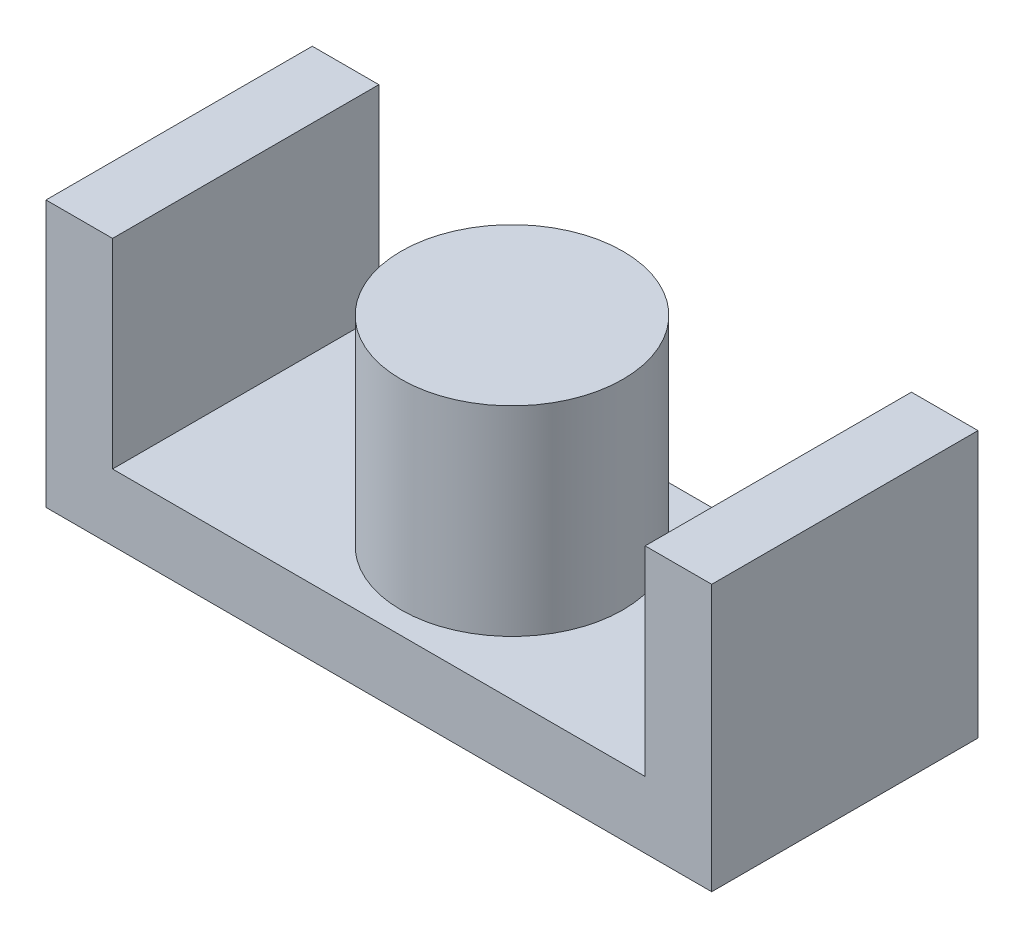
ISO-10303-21;
HEADER;
FILE_DESCRIPTION(('STEP AP214'),'2;1');
FILE_NAME('part.step','',(''),(''),'','','');
FILE_SCHEMA(('AUTOMOTIVE_DESIGN { 1 0 10303 214 1 1 1 1 }'));
ENDSEC;
DATA;
#1=APPLICATION_CONTEXT('core data for automotive mechanical design processes');
#2=APPLICATION_PROTOCOL_DEFINITION('international standard','automotive_design',2000,#1);
#3=PRODUCT_CONTEXT('',#1,'mechanical');
#4=PRODUCT('Part','Part','',(#3));
#5=PRODUCT_RELATED_PRODUCT_CATEGORY('part','',(#4));
#6=PRODUCT_DEFINITION_FORMATION('','',#4);
#7=PRODUCT_DEFINITION_CONTEXT('part definition',#1,'design');
#8=PRODUCT_DEFINITION('design','',#6,#7);
#9=PRODUCT_DEFINITION_SHAPE('','',#8);
#10=(LENGTH_UNIT() NAMED_UNIT(*) SI_UNIT(.MILLI.,.METRE.));
#11=(NAMED_UNIT(*) PLANE_ANGLE_UNIT() SI_UNIT($,.RADIAN.));
#12=(NAMED_UNIT(*) SI_UNIT($,.STERADIAN.) SOLID_ANGLE_UNIT());
#13=UNCERTAINTY_MEASURE_WITH_UNIT(LENGTH_MEASURE(1.E-05),#10,'distance_accuracy_value','');
#14=(GEOMETRIC_REPRESENTATION_CONTEXT(3) GLOBAL_UNCERTAINTY_ASSIGNED_CONTEXT((#13)) GLOBAL_UNIT_ASSIGNED_CONTEXT((#10,
#11,#12)) REPRESENTATION_CONTEXT('',''));
#15=CARTESIAN_POINT('',(0.,0.,0.));
#16=DIRECTION('',(0.,0.,1.));
#17=DIRECTION('',(1.,0.,0.));
#18=AXIS2_PLACEMENT_3D('',#15,#16,#17);
#19=CARTESIAN_POINT('',(0.,1.905,0.));
#20=DIRECTION('',(0.,-1.,0.));
#21=DIRECTION('',(0.,0.,-1.));
#22=AXIS2_PLACEMENT_3D('',#19,#20,#21);
#23=PLANE('',#22);
#24=CARTESIAN_POINT('',(-9.525,1.905,3.81));
#25=DIRECTION('',(0.,1.,0.));
#26=DIRECTION('',(0.,0.,1.));
#27=AXIS2_PLACEMENT_3D('',#24,#25,#26);
#28=CIRCLE('',#27,3.175);
#29=CARTESIAN_POINT('',(-9.525,1.905,6.985));
#30=VERTEX_POINT('',#29);
#31=EDGE_CURVE('E11',#30,#30,#28,.T.);
#32=ORIENTED_EDGE('',*,*,#31,.F.);
#33=EDGE_LOOP('',(#32));
#34=FACE_BOUND('',#33,.T.);
#35=DIRECTION('',(0.,0.,1.));
#36=VECTOR('',#35,1.);
#37=CARTESIAN_POINT('',(-1.905,1.905,7.62));
#38=LINE('',#37,#36);
#39=CARTESIAN_POINT('',(-1.905,1.905,0.));
#40=VERTEX_POINT('',#39);
#41=CARTESIAN_POINT('',(-1.905,1.905,7.62));
#42=VERTEX_POINT('',#41);
#43=EDGE_CURVE('E53',#40,#42,#38,.T.);
#44=ORIENTED_EDGE('',*,*,#43,.F.);
#45=DIRECTION('',(-1.,0.,0.));
#46=VECTOR('',#45,1.);
#47=CARTESIAN_POINT('',(0.,1.905,0.));
#48=LINE('',#47,#46);
#49=CARTESIAN_POINT('',(-17.145,1.905,0.));
#50=VERTEX_POINT('',#49);
#51=EDGE_CURVE('E154',#40,#50,#48,.T.);
#52=ORIENTED_EDGE('',*,*,#51,.T.);
#53=DIRECTION('',(0.,0.,-1.));
#54=VECTOR('',#53,1.);
#55=CARTESIAN_POINT('',(-17.145,1.905,7.62));
#56=LINE('',#55,#54);
#57=CARTESIAN_POINT('',(-17.145,1.905,7.62));
#58=VERTEX_POINT('',#57);
#59=EDGE_CURVE('E56',#58,#50,#56,.T.);
#60=ORIENTED_EDGE('',*,*,#59,.F.);
#61=DIRECTION('',(1.,0.,0.));
#62=VECTOR('',#61,1.);
#63=CARTESIAN_POINT('',(0.,1.905,7.62));
#64=LINE('',#63,#62);
#65=EDGE_CURVE('E157',#58,#42,#64,.T.);
#66=ORIENTED_EDGE('',*,*,#65,.T.);
#67=EDGE_LOOP('',(#44,#52,#60,#66));
#68=FACE_BOUND('',#67,.T.);
#69=ADVANCED_FACE('F36',(#34,#68),#23,.F.);
#70=CARTESIAN_POINT('',(0.,1.905,0.));
#71=DIRECTION('',(-1.,0.,0.));
#72=DIRECTION('',(0.,0.,1.));
#73=AXIS2_PLACEMENT_3D('',#70,#71,#72);
#74=PLANE('',#73);
#75=DIRECTION('',(0.,0.,-1.));
#76=VECTOR('',#75,1.);
#77=CARTESIAN_POINT('',(0.,0.,0.));
#78=LINE('',#77,#76);
#79=CARTESIAN_POINT('',(0.,0.,7.62));
#80=VERTEX_POINT('',#79);
#81=CARTESIAN_POINT('',(0.,0.,0.));
#82=VERTEX_POINT('',#81);
#83=EDGE_CURVE('E129',#80,#82,#78,.T.);
#84=ORIENTED_EDGE('',*,*,#83,.T.);
#85=DIRECTION('',(0.,-1.,0.));
#86=VECTOR('',#85,1.);
#87=CARTESIAN_POINT('',(0.,1.905,0.));
#88=LINE('',#87,#86);
#89=CARTESIAN_POINT('',(0.,7.62,0.));
#90=VERTEX_POINT('',#89);
#91=EDGE_CURVE('E45',#90,#82,#88,.T.);
#92=ORIENTED_EDGE('',*,*,#91,.F.);
#93=DIRECTION('',(0.,0.,-1.));
#94=VECTOR('',#93,1.);
#95=CARTESIAN_POINT('',(0.,7.62,7.62));
#96=LINE('',#95,#94);
#97=CARTESIAN_POINT('',(0.,7.62,7.62));
#98=VERTEX_POINT('',#97);
#99=EDGE_CURVE('E118',#98,#90,#96,.T.);
#100=ORIENTED_EDGE('',*,*,#99,.F.);
#101=DIRECTION('',(0.,-1.,0.));
#102=VECTOR('',#101,1.);
#103=CARTESIAN_POINT('',(0.,1.905,7.62));
#104=LINE('',#103,#102);
#105=EDGE_CURVE('E114',#98,#80,#104,.T.);
#106=ORIENTED_EDGE('',*,*,#105,.T.);
#107=EDGE_LOOP('',(#84,#92,#100,#106));
#108=FACE_BOUND('',#107,.T.);
#109=ADVANCED_FACE('F37',(#108),#74,.F.);
#110=CARTESIAN_POINT('',(0.,1.905,0.));
#111=DIRECTION('',(0.,0.,1.));
#112=DIRECTION('',(1.,0.,0.));
#113=AXIS2_PLACEMENT_3D('',#110,#111,#112);
#114=PLANE('',#113);
#115=DIRECTION('',(-1.,0.,0.));
#116=VECTOR('',#115,1.);
#117=CARTESIAN_POINT('',(0.,0.,0.));
#118=LINE('',#117,#116);
#119=CARTESIAN_POINT('',(-19.05,0.,0.));
#120=VERTEX_POINT('',#119);
#121=EDGE_CURVE('E162',#82,#120,#118,.T.);
#122=ORIENTED_EDGE('',*,*,#121,.T.);
#123=DIRECTION('',(0.,-1.,0.));
#124=VECTOR('',#123,1.);
#125=CARTESIAN_POINT('',(-19.05,1.905,0.));
#126=LINE('',#125,#124);
#127=CARTESIAN_POINT('',(-19.05,7.62,0.));
#128=VERTEX_POINT('',#127);
#129=EDGE_CURVE('E167',#128,#120,#126,.T.);
#130=ORIENTED_EDGE('',*,*,#129,.F.);
#131=DIRECTION('',(-1.,0.,0.));
#132=VECTOR('',#131,1.);
#133=CARTESIAN_POINT('',(-19.05,7.62,0.));
#134=LINE('',#133,#132);
#135=CARTESIAN_POINT('',(-17.145,7.62,0.));
#136=VERTEX_POINT('',#135);
#137=EDGE_CURVE('E140',#136,#128,#134,.T.);
#138=ORIENTED_EDGE('',*,*,#137,.F.);
#139=DIRECTION('',(0.,-1.,0.));
#140=VECTOR('',#139,1.);
#141=CARTESIAN_POINT('',(-17.145,15.4745162168016,0.));
#142=LINE('',#141,#140);
#143=EDGE_CURVE('E137',#136,#50,#142,.T.);
#144=ORIENTED_EDGE('',*,*,#143,.T.);
#145=ORIENTED_EDGE('',*,*,#51,.F.);
#146=DIRECTION('',(0.,-1.,0.));
#147=VECTOR('',#146,1.);
#148=CARTESIAN_POINT('',(-1.905,15.4745162168016,0.));
#149=LINE('',#148,#147);
#150=CARTESIAN_POINT('',(-1.905,7.62,0.));
#151=VERTEX_POINT('',#150);
#152=EDGE_CURVE('E133',#151,#40,#149,.T.);
#153=ORIENTED_EDGE('',*,*,#152,.F.);
#154=DIRECTION('',(-1.,0.,0.));
#155=VECTOR('',#154,1.);
#156=CARTESIAN_POINT('',(0.,7.62,0.));
#157=LINE('',#156,#155);
#158=EDGE_CURVE('E121',#90,#151,#157,.T.);
#159=ORIENTED_EDGE('',*,*,#158,.F.);
#160=ORIENTED_EDGE('',*,*,#91,.T.);
#161=EDGE_LOOP('',(#122,#130,#138,#144,#145,#153,#159,#160));
#162=FACE_BOUND('',#161,.T.);
#163=ADVANCED_FACE('F180',(#162),#114,.F.);
#164=CARTESIAN_POINT('',(-19.05,1.905,0.));
#165=DIRECTION('',(1.,0.,0.));
#166=DIRECTION('',(0.,0.,-1.));
#167=AXIS2_PLACEMENT_3D('',#164,#165,#166);
#168=PLANE('',#167);
#169=DIRECTION('',(0.,0.,1.));
#170=VECTOR('',#169,1.);
#171=CARTESIAN_POINT('',(-19.05,0.,0.));
#172=LINE('',#171,#170);
#173=CARTESIAN_POINT('',(-19.05,0.,7.62));
#174=VERTEX_POINT('',#173);
#175=EDGE_CURVE('E165',#120,#174,#172,.T.);
#176=ORIENTED_EDGE('',*,*,#175,.T.);
#177=DIRECTION('',(0.,-1.,0.));
#178=VECTOR('',#177,1.);
#179=CARTESIAN_POINT('',(-19.05,1.905,7.62));
#180=LINE('',#179,#178);
#181=CARTESIAN_POINT('',(-19.05,7.62,7.62));
#182=VERTEX_POINT('',#181);
#183=EDGE_CURVE('E166',#182,#174,#180,.T.);
#184=ORIENTED_EDGE('',*,*,#183,.F.);
#185=DIRECTION('',(0.,0.,1.));
#186=VECTOR('',#185,1.);
#187=CARTESIAN_POINT('',(-19.05,7.62,7.62));
#188=LINE('',#187,#186);
#189=EDGE_CURVE('E143',#128,#182,#188,.T.);
#190=ORIENTED_EDGE('',*,*,#189,.F.);
#191=ORIENTED_EDGE('',*,*,#129,.T.);
#192=EDGE_LOOP('',(#176,#184,#190,#191));
#193=FACE_BOUND('',#192,.T.);
#194=ADVANCED_FACE('F182',(#193),#168,.F.);
#195=CARTESIAN_POINT('',(0.,1.905,7.62));
#196=DIRECTION('',(0.,0.,-1.));
#197=DIRECTION('',(-1.,0.,0.));
#198=AXIS2_PLACEMENT_3D('',#195,#196,#197);
#199=PLANE('',#198);
#200=DIRECTION('',(1.,0.,0.));
#201=VECTOR('',#200,1.);
#202=CARTESIAN_POINT('',(0.,0.,7.62));
#203=LINE('',#202,#201);
#204=EDGE_CURVE('E159',#174,#80,#203,.T.);
#205=ORIENTED_EDGE('',*,*,#204,.T.);
#206=ORIENTED_EDGE('',*,*,#105,.F.);
#207=DIRECTION('',(1.,0.,0.));
#208=VECTOR('',#207,1.);
#209=CARTESIAN_POINT('',(0.,7.62,7.62));
#210=LINE('',#209,#208);
#211=CARTESIAN_POINT('',(-1.905,7.62,7.62));
#212=VERTEX_POINT('',#211);
#213=EDGE_CURVE('E109',#212,#98,#210,.T.);
#214=ORIENTED_EDGE('',*,*,#213,.F.);
#215=DIRECTION('',(0.,-1.,0.));
#216=VECTOR('',#215,1.);
#217=CARTESIAN_POINT('',(-1.905,15.4745162168016,7.62));
#218=LINE('',#217,#216);
#219=EDGE_CURVE('E105',#212,#42,#218,.T.);
#220=ORIENTED_EDGE('',*,*,#219,.T.);
#221=ORIENTED_EDGE('',*,*,#65,.F.);
#222=DIRECTION('',(0.,-1.,0.));
#223=VECTOR('',#222,1.);
#224=CARTESIAN_POINT('',(-17.145,15.4745162168016,7.62));
#225=LINE('',#224,#223);
#226=CARTESIAN_POINT('',(-17.145,7.62,7.62));
#227=VERTEX_POINT('',#226);
#228=EDGE_CURVE('E134',#227,#58,#225,.T.);
#229=ORIENTED_EDGE('',*,*,#228,.F.);
#230=DIRECTION('',(1.,0.,0.));
#231=VECTOR('',#230,1.);
#232=CARTESIAN_POINT('',(-19.05,7.62,7.62));
#233=LINE('',#232,#231);
#234=EDGE_CURVE('E149',#182,#227,#233,.T.);
#235=ORIENTED_EDGE('',*,*,#234,.F.);
#236=ORIENTED_EDGE('',*,*,#183,.T.);
#237=EDGE_LOOP('',(#205,#206,#214,#220,#221,#229,#235,#236));
#238=FACE_BOUND('',#237,.T.);
#239=ADVANCED_FACE('F113',(#238),#199,.F.);
#240=CARTESIAN_POINT('',(0.,0.,0.));
#241=DIRECTION('',(0.,-1.,0.));
#242=DIRECTION('',(0.,0.,-1.));
#243=AXIS2_PLACEMENT_3D('',#240,#241,#242);
#244=PLANE('',#243);
#245=ORIENTED_EDGE('',*,*,#83,.F.);
#246=ORIENTED_EDGE('',*,*,#204,.F.);
#247=ORIENTED_EDGE('',*,*,#175,.F.);
#248=ORIENTED_EDGE('',*,*,#121,.F.);
#249=EDGE_LOOP('',(#245,#246,#247,#248));
#250=FACE_BOUND('',#249,.T.);
#251=ADVANCED_FACE('F185',(#250),#244,.T.);
#252=CARTESIAN_POINT('',(-9.525,7.62,3.81));
#253=DIRECTION('',(0.,-1.,0.));
#254=DIRECTION('',(0.,0.,-1.));
#255=AXIS2_PLACEMENT_3D('',#252,#253,#254);
#256=CYLINDRICAL_SURFACE('',#255,3.175);
#257=CARTESIAN_POINT('',(-9.525,7.62,3.81));
#258=DIRECTION('',(0.,1.,0.));
#259=DIRECTION('',(0.,0.,1.));
#260=AXIS2_PLACEMENT_3D('',#257,#258,#259);
#261=CIRCLE('',#260,3.175);
#262=CARTESIAN_POINT('',(-9.525,7.62,6.985));
#263=VERTEX_POINT('',#262);
#264=EDGE_CURVE('E123',#263,#263,#261,.T.);
#265=ORIENTED_EDGE('',*,*,#264,.F.);
#266=EDGE_LOOP('',(#265));
#267=FACE_BOUND('',#266,.T.);
#268=ORIENTED_EDGE('',*,*,#31,.T.);
#269=EDGE_LOOP('',(#268));
#270=FACE_BOUND('',#269,.T.);
#271=ADVANCED_FACE('F199',(#267,#270),#256,.T.);
#272=CARTESIAN_POINT('',(-9.525,7.62,3.81));
#273=DIRECTION('',(0.,1.,0.));
#274=DIRECTION('',(0.,0.,1.));
#275=AXIS2_PLACEMENT_3D('',#272,#273,#274);
#276=PLANE('',#275);
#277=ORIENTED_EDGE('',*,*,#264,.T.);
#278=EDGE_LOOP('',(#277));
#279=FACE_BOUND('',#278,.T.);
#280=ADVANCED_FACE('F195',(#279),#276,.T.);
#281=CARTESIAN_POINT('',(-17.145,15.4745162168016,7.62));
#282=DIRECTION('',(-1.,0.,0.));
#283=DIRECTION('',(0.,0.,1.));
#284=AXIS2_PLACEMENT_3D('',#281,#282,#283);
#285=PLANE('',#284);
#286=DIRECTION('',(0.,0.,-1.));
#287=VECTOR('',#286,1.);
#288=CARTESIAN_POINT('',(-17.145,7.62,7.62));
#289=LINE('',#288,#287);
#290=EDGE_CURVE('E151',#227,#136,#289,.T.);
#291=ORIENTED_EDGE('',*,*,#290,.F.);
#292=ORIENTED_EDGE('',*,*,#228,.T.);
#293=ORIENTED_EDGE('',*,*,#59,.T.);
#294=ORIENTED_EDGE('',*,*,#143,.F.);
#295=EDGE_LOOP('',(#291,#292,#293,#294));
#296=FACE_BOUND('',#295,.T.);
#297=ADVANCED_FACE('F188',(#296),#285,.F.);
#298=CARTESIAN_POINT('',(-9.525,7.62,3.81));
#299=DIRECTION('',(0.,1.,0.));
#300=DIRECTION('',(0.,0.,1.));
#301=AXIS2_PLACEMENT_3D('',#298,#299,#300);
#302=PLANE('',#301);
#303=ORIENTED_EDGE('',*,*,#137,.T.);
#304=ORIENTED_EDGE('',*,*,#189,.T.);
#305=ORIENTED_EDGE('',*,*,#234,.T.);
#306=ORIENTED_EDGE('',*,*,#290,.T.);
#307=EDGE_LOOP('',(#303,#304,#305,#306));
#308=FACE_BOUND('',#307,.T.);
#309=ADVANCED_FACE('F190',(#308),#302,.T.);
#310=CARTESIAN_POINT('',(-1.905,15.4745162168016,7.62));
#311=DIRECTION('',(1.,0.,0.));
#312=DIRECTION('',(0.,0.,-1.));
#313=AXIS2_PLACEMENT_3D('',#310,#311,#312);
#314=PLANE('',#313);
#315=DIRECTION('',(0.,0.,1.));
#316=VECTOR('',#315,1.);
#317=CARTESIAN_POINT('',(-1.905,7.62,7.62));
#318=LINE('',#317,#316);
#319=EDGE_CURVE('E110',#151,#212,#318,.T.);
#320=ORIENTED_EDGE('',*,*,#319,.F.);
#321=ORIENTED_EDGE('',*,*,#152,.T.);
#322=ORIENTED_EDGE('',*,*,#43,.T.);
#323=ORIENTED_EDGE('',*,*,#219,.F.);
#324=EDGE_LOOP('',(#320,#321,#322,#323));
#325=FACE_BOUND('',#324,.T.);
#326=ADVANCED_FACE('F104',(#325),#314,.F.);
#327=CARTESIAN_POINT('',(-9.525,7.62,3.81));
#328=DIRECTION('',(0.,1.,0.));
#329=DIRECTION('',(0.,0.,1.));
#330=AXIS2_PLACEMENT_3D('',#327,#328,#329);
#331=PLANE('',#330);
#332=ORIENTED_EDGE('',*,*,#213,.T.);
#333=ORIENTED_EDGE('',*,*,#99,.T.);
#334=ORIENTED_EDGE('',*,*,#158,.T.);
#335=ORIENTED_EDGE('',*,*,#319,.T.);
#336=EDGE_LOOP('',(#332,#333,#334,#335));
#337=FACE_BOUND('',#336,.T.);
#338=ADVANCED_FACE('F125',(#337),#331,.T.);
#339=CLOSED_SHELL('',(#69,#109,#163,#194,#239,#251,#271,#280,#297,#309,#326,#338));
#340=MANIFOLD_SOLID_BREP('B2',#339);
#341=ADVANCED_BREP_SHAPE_REPRESENTATION('',(#18,#340),#14);
#342=SHAPE_DEFINITION_REPRESENTATION(#9,#341);
ENDSEC;
END-ISO-10303-21;
